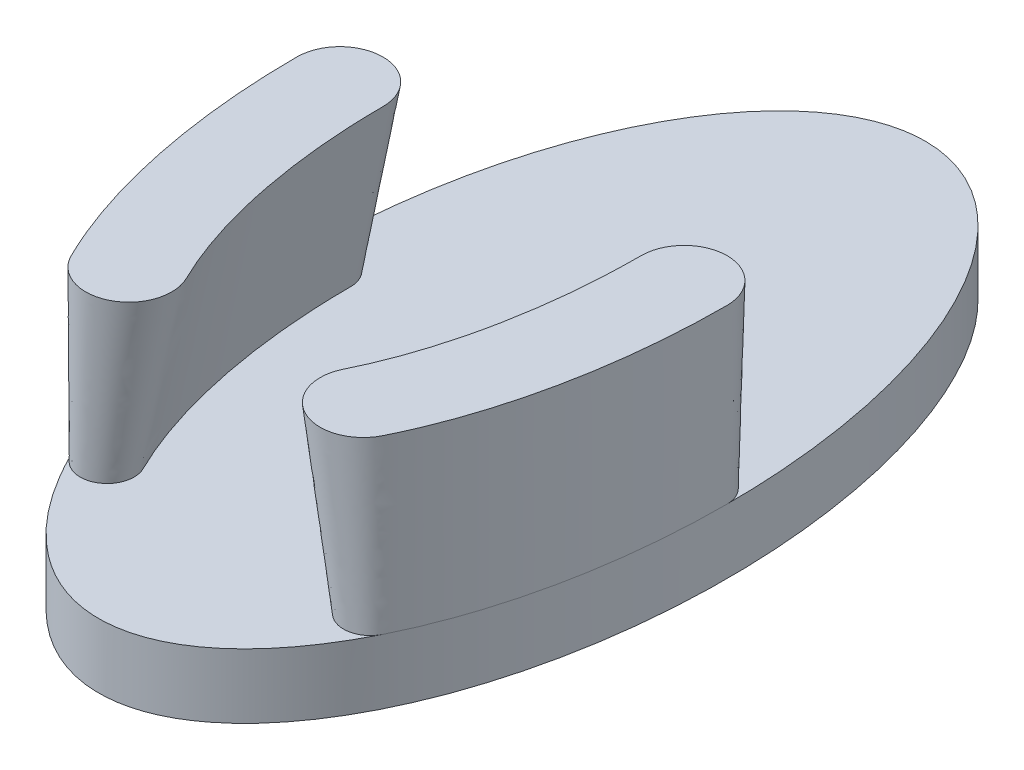
ISO-10303-21;
HEADER;
FILE_DESCRIPTION(('STEP AP214'),'2;1');
FILE_NAME('part.step','',(''),(''),'','','');
FILE_SCHEMA(('AUTOMOTIVE_DESIGN { 1 0 10303 214 1 1 1 1 }'));
ENDSEC;
DATA;
#1=APPLICATION_CONTEXT('core data for automotive mechanical design processes');
#2=APPLICATION_PROTOCOL_DEFINITION('international standard','automotive_design',2000,#1);
#3=PRODUCT_CONTEXT('',#1,'mechanical');
#4=PRODUCT('Part','Part','',(#3));
#5=PRODUCT_RELATED_PRODUCT_CATEGORY('part','',(#4));
#6=PRODUCT_DEFINITION_FORMATION('','',#4);
#7=PRODUCT_DEFINITION_CONTEXT('part definition',#1,'design');
#8=PRODUCT_DEFINITION('design','',#6,#7);
#9=PRODUCT_DEFINITION_SHAPE('','',#8);
#10=(LENGTH_UNIT() NAMED_UNIT(*) SI_UNIT(.MILLI.,.METRE.));
#11=(NAMED_UNIT(*) PLANE_ANGLE_UNIT() SI_UNIT($,.RADIAN.));
#12=(NAMED_UNIT(*) SI_UNIT($,.STERADIAN.) SOLID_ANGLE_UNIT());
#13=UNCERTAINTY_MEASURE_WITH_UNIT(LENGTH_MEASURE(1.E-05),#10,'distance_accuracy_value','');
#14=(GEOMETRIC_REPRESENTATION_CONTEXT(3) GLOBAL_UNCERTAINTY_ASSIGNED_CONTEXT((#13)) GLOBAL_UNIT_ASSIGNED_CONTEXT((#10,
#11,#12)) REPRESENTATION_CONTEXT('',''));
#15=CARTESIAN_POINT('',(0.,0.,0.));
#16=DIRECTION('',(0.,0.,1.));
#17=DIRECTION('',(1.,0.,0.));
#18=AXIS2_PLACEMENT_3D('',#15,#16,#17);
#19=CARTESIAN_POINT('',(0.,3.,0.));
#20=DIRECTION('',(0.,1.,0.));
#21=DIRECTION('',(0.,0.,1.));
#22=AXIS2_PLACEMENT_3D('',#19,#20,#21);
#23=PLANE('',#22);
#24=CARTESIAN_POINT('',(6.11987871457012,3.,12.6999444809469));
#25=DIRECTION('',(0.,-1.,0.));
#26=DIRECTION('',(0.,0.,1.));
#27=AXIS2_PLACEMENT_3D('',#24,#25,#26);
#28=CIRCLE('',#27,1.25);
#29=CARTESIAN_POINT('',(7.2397724042015,3.,13.2552641341771));
#30=VERTEX_POINT('',#29);
#31=CARTESIAN_POINT('',(5.00000000000003,3.,12.1446322582713));
#32=VERTEX_POINT('',#31);
#33=EDGE_CURVE('E247',#30,#32,#28,.T.);
#34=ORIENTED_EDGE('',*,*,#33,.T.);
#35=CARTESIAN_POINT('',(5.,3.,12.1446322582714));
#36=CARTESIAN_POINT('',(5.19774336303586,3.,11.7458501422494));
#37=CARTESIAN_POINT('',(5.55436612010594,3.,10.9531589873972));
#38=CARTESIAN_POINT('',(6.22056986626798,3.,9.15948566509267));
#39=CARTESIAN_POINT('',(6.88663015631573,3.,6.67624798111628));
#40=CARTESIAN_POINT('',(7.38711573347857,3.,3.41196846074801));
#41=CARTESIAN_POINT('',(7.5,3.,1.12988821116082));
#42=CARTESIAN_POINT('',(7.5,3.,0.));
#43=B_SPLINE_CURVE_WITH_KNOTS('',3,(#35,#36,#37,#38,#39,#40,#41,#42),.UNSPECIFIED.,.F.,.F.,(4,1,
1,1,1,4),(1.5707963267949,1.66595231404152,1.76110830128814,1.95142027578138,2.14173225027461,
2.33204422476785),.UNSPECIFIED.);
#44=CARTESIAN_POINT('',(7.5,3.,-1.37442928484785E-07));
#45=VERTEX_POINT('',#44);
#46=EDGE_CURVE('E252',#32,#45,#43,.T.);
#47=ORIENTED_EDGE('',*,*,#46,.T.);
#48=CARTESIAN_POINT('',(8.75,3.,0.));
#49=DIRECTION('',(0.,-1.,0.));
#50=DIRECTION('',(0.,0.,-1.));
#51=AXIS2_PLACEMENT_3D('',#48,#49,#50);
#52=CIRCLE('',#51,1.25);
#53=CARTESIAN_POINT('',(10.,3.,0.));
#54=VERTEX_POINT('',#53);
#55=EDGE_CURVE('E233',#45,#54,#52,.T.);
#56=ORIENTED_EDGE('',*,*,#55,.T.);
#57=CARTESIAN_POINT('',(0.,3.,0.));
#58=DIRECTION('',(0.,-1.,0.));
#59=DIRECTION('',(0.,0.,-1.));
#60=AXIS2_PLACEMENT_3D('',#57,#58,#59);
#61=ELLIPSE('',#60,19.2153784566105,10.);
#62=CARTESIAN_POINT('',(-9.99999999905929,3.,-0.000108424452932332));
#63=VERTEX_POINT('',#62);
#64=EDGE_CURVE('E502',#54,#63,#61,.F.);
#65=ORIENTED_EDGE('',*,*,#64,.T.);
#66=CARTESIAN_POINT('',(-7.5,3.,0.));
#67=CARTESIAN_POINT('',(-7.49998923633098,3.,-0.0351697874300073));
#68=CARTESIAN_POINT('',(-7.50143294013653,3.,-0.0703438189006792));
#69=CARTESIAN_POINT('',(-7.50726062229391,3.,-0.14044459233977));
#70=CARTESIAN_POINT('',(-7.51164442416949,3.,-0.175371349023445));
#71=CARTESIAN_POINT('',(-7.52337703823223,3.,-0.244687115002351));
#72=CARTESIAN_POINT('',(-7.53072251345142,3.,-0.279076684408285));
#73=CARTESIAN_POINT('',(-7.54833036462945,3.,-0.347091192160089));
#74=CARTESIAN_POINT('',(-7.55859279667201,3.,-0.380716115790849));
#75=CARTESIAN_POINT('',(-7.5936080859151,3.,-0.480122245831025));
#76=CARTESIAN_POINT('',(-7.62259420526411,3.,-0.544465473624005));
#77=CARTESIAN_POINT('',(-7.69085633688877,3.,-0.667396839264811));
#78=CARTESIAN_POINT('',(-7.73013230413657,3.,-0.725985002294966));
#79=CARTESIAN_POINT('',(-7.81810936134942,3.,-0.835915778969195));
#80=CARTESIAN_POINT('',(-7.86684066819131,3.,-0.887234225673415));
#81=CARTESIAN_POINT('',(-7.9722527972439,3.,-0.980984154243796));
#82=CARTESIAN_POINT('',(-8.02893368508665,3.,-1.02341556273102));
#83=CARTESIAN_POINT('',(-8.11861641034821,3.,-1.07936805200126));
#84=CARTESIAN_POINT('',(-8.14927926521871,3.,-1.09673304855542));
#85=CARTESIAN_POINT('',(-8.21192955359622,3.,-1.12879839917933));
#86=CARTESIAN_POINT('',(-8.24391565807669,3.,-1.14350135075364));
#87=CARTESIAN_POINT('',(-8.34158715591077,3.,-1.1834850306019));
#88=CARTESIAN_POINT('',(-8.40900983811339,3.,-1.20465557897171));
#89=CARTESIAN_POINT('',(-8.54634302819597,3.,-1.23537194437348));
#90=CARTESIAN_POINT('',(-8.616250769451,3.,-1.2449302963964));
#91=CARTESIAN_POINT('',(-8.75668577196107,3.,-1.2521057556406));
#92=CARTESIAN_POINT('',(-8.82721300795331,3.,-1.2497233475661));
#93=CARTESIAN_POINT('',(-8.96664004343919,3.,-1.23314936884242));
#94=CARTESIAN_POINT('',(-9.03554417589725,3.,-1.21899408909712));
#95=CARTESIAN_POINT('',(-9.17002117881914,3.,-1.17938937691705));
#96=CARTESIAN_POINT('',(-9.23559385954583,3.,-1.15393930200837));
#97=CARTESIAN_POINT('',(-9.36183439930573,3.,-1.09226017263906));
#98=CARTESIAN_POINT('',(-9.42248125554396,3.,-1.0559877588044));
#99=CARTESIAN_POINT('',(-9.50814787149243,3.,-0.994370836508828));
#100=CARTESIAN_POINT('',(-9.5358224408257,3.,-0.972627464425052));
#101=CARTESIAN_POINT('',(-9.58928000613686,3.,-0.926865544870687));
#102=CARTESIAN_POINT('',(-9.61506068936126,3.,-0.90284429507819));
#103=CARTESIAN_POINT('',(-9.68912323285703,3.,-0.827756552668588));
#104=CARTESIAN_POINT('',(-9.73428839033874,3.,-0.773548605441722));
#105=CARTESIAN_POINT('',(-9.81485447234115,3.,-0.658310749437763));
#106=CARTESIAN_POINT('',(-9.85025566168989,3.,-0.59728102575076));
#107=CARTESIAN_POINT('',(-9.89543790105036,3.,-0.501882838826152));
#108=CARTESIAN_POINT('',(-9.90920539897127,3.,-0.469346963329483));
#109=CARTESIAN_POINT('',(-9.93391979094434,3.,-0.403241911367588));
#110=CARTESIAN_POINT('',(-9.94486911433998,3.,-0.369673652982634));
#111=CARTESIAN_POINT('',(-9.96383569822752,3.,-0.301760026177581));
#112=CARTESIAN_POINT('',(-9.97185604743035,3.,-0.267415517178146));
#113=CARTESIAN_POINT('',(-9.98492352795874,3.,-0.198171568438072));
#114=CARTESIAN_POINT('',(-9.98997147281918,3.,-0.163272283225508));
#115=CARTESIAN_POINT('',(-9.99569977079587,3.,-0.106930653519564));
#116=CARTESIAN_POINT('',(-9.99731661506854,3.,-0.0855787612981533));
#117=CARTESIAN_POINT('',(-9.99946542714367,3.,-0.04285454886194));
#118=CARTESIAN_POINT('',(-9.99999912551782,3.,-0.0214823159030659));
#119=CARTESIAN_POINT('',(-9.99999999544732,3.,-0.00010842445262965));
#120=B_SPLINE_CURVE_WITH_KNOTS('',3,(#66,#67,#68,#69,#70,#71,#72,#73,#74,#75,#76,#77,#78,#79,
#80,#81,#82,#83,#84,#85,#86,#87,#88,#89,#90,#91,#92,#93,#94,#95,#96,#97,#98,#99,#100,#101,#102,
#103,#104,#105,#106,#107,#108,#109,#110,#111,#112,#113,#114,#115,#116,#117,#118,#119),
.UNSPECIFIED.,.F.,.F.,(4,2,2,2,2,2,2,2,2,2,2,2,2,2,2,2,2,2,2,2,2,2,2,2,2,2,4),(0.,
0.105484859426658,0.210963387803589,0.316323402352031,0.421685442772485,0.63231738863455,
0.842948412797248,1.05426398963555,1.26558131120602,1.37118693922898,1.47668896003441,
1.68760892611054,1.89830100800993,2.10898453747942,2.31902101333656,2.52906943808294,
2.73997098180776,2.8454468418955,2.95104943537915,3.16166003683901,3.37226492534746,
3.47814753072682,3.58393855437918,3.68961769314577,3.79526789450456,3.8594818815186,
3.92359319107138),.UNSPECIFIED.);
#121=CARTESIAN_POINT('',(-7.5,3.,0.));
#122=VERTEX_POINT('',#121);
#123=EDGE_CURVE('E459',#122,#63,#120,.T.);
#124=ORIENTED_EDGE('',*,*,#123,.F.);
#125=CARTESIAN_POINT('',(-5.00000000000003,3.,12.1446322582713));
#126=CARTESIAN_POINT('',(-5.06741385636489,3.,12.0086711300577));
#127=CARTESIAN_POINT('',(-5.1330116869429,3.,11.8718216882076));
#128=CARTESIAN_POINT('',(-5.26073653736773,3.,11.5965252535735));
#129=CARTESIAN_POINT('',(-5.32286384247364,3.,11.4580783932209));
#130=CARTESIAN_POINT('',(-5.50405381994333,3.,11.0411382573568));
#131=CARTESIAN_POINT('',(-5.61819530822051,3.,10.7604952338548));
#132=CARTESIAN_POINT('',(-5.83429328571383,3.,10.1948382992218));
#133=CARTESIAN_POINT('',(-5.93625913914259,3.,9.90982793984572));
#134=CARTESIAN_POINT('',(-6.1289109615006,3.,9.33606254139926));
#135=CARTESIAN_POINT('',(-6.21959810966435,3.,9.04730789730098));
#136=CARTESIAN_POINT('',(-6.38935730500458,3.,8.47057840211037));
#137=CARTESIAN_POINT('',(-6.46856751163175,3.,8.18264404813391));
#138=CARTESIAN_POINT('',(-6.61742635272034,3.,7.60420368596284));
#139=CARTESIAN_POINT('',(-6.68707133431754,3.,7.31369674015424));
#140=CARTESIAN_POINT('',(-6.8171715400268,3.,6.73056464954379));
#141=CARTESIAN_POINT('',(-6.87762460581459,3.,6.43793902410756));
#142=CARTESIAN_POINT('',(-6.98956621354144,3.,5.85099670788306));
#143=CARTESIAN_POINT('',(-7.04105518779658,3.,5.5566800993543));
#144=CARTESIAN_POINT('',(-7.13447381918345,3.,4.97322103510431));
#145=CARTESIAN_POINT('',(-7.17658989927882,3.,4.68410831164011));
#146=CARTESIAN_POINT('',(-7.25294957194358,3.,4.10492896673727));
#147=CARTESIAN_POINT('',(-7.28719535881017,3.,3.81486263410462));
#148=CARTESIAN_POINT('',(-7.34796639443396,3.,3.23395670164698));
#149=CARTESIAN_POINT('',(-7.37449251716567,3.,2.9431171931216));
#150=CARTESIAN_POINT('',(-7.42013746482407,3.,2.35795191804553));
#151=CARTESIAN_POINT('',(-7.43918010093686,3.,2.06362021656363));
#152=CARTESIAN_POINT('',(-7.4696177582379,3.,1.47453058366295));
#153=CARTESIAN_POINT('',(-7.48101194352042,3.,1.17977260918323));
#154=CARTESIAN_POINT('',(-7.49619809156091,3.,0.590009423492115));
#155=CARTESIAN_POINT('',(-7.49998873337344,3.,0.295004178227221));
#156=CARTESIAN_POINT('',(-7.5,3.,0.));
#157=B_SPLINE_CURVE_WITH_KNOTS('',3,(#125,#126,#127,#128,#129,#130,#131,#132,#133,#134,#135,
#136,#137,#138,#139,#140,#141,#142,#143,#144,#145,#146,#147,#148,#149,#150,#151,#152,#153,#154,
#155,#156),.UNSPECIFIED.,.F.,.F.,(4,2,2,2,2,2,2,2,2,2,2,2,2,2,2,4),(0.,0.455237869873625,
0.910438266343984,1.81900142557622,2.72686125078859,3.63462607562454,4.53034521380883,
5.42640547269032,6.32267580876717,7.21890290794881,8.09528525805587,8.97142296891083,
9.8474614500382,10.7322010625433,11.6170373532618,12.5020273511669),.UNSPECIFIED.);
#158=CARTESIAN_POINT('',(-5.00000000000003,3.,12.1446322582713));
#159=VERTEX_POINT('',#158);
#160=EDGE_CURVE('E314',#159,#122,#157,.T.);
#161=ORIENTED_EDGE('',*,*,#160,.F.);
#162=CARTESIAN_POINT('',(-5.00000000000003,3.,12.1446322582713));
#163=CARTESIAN_POINT('',(-4.98436756747829,3.,12.1761334189842));
#164=CARTESIAN_POINT('',(-4.97003607818218,3.,12.2082844120324));
#165=CARTESIAN_POINT('',(-4.94411666041171,3.,12.2736708974496));
#166=CARTESIAN_POINT('',(-4.93252856760844,3.,12.3069063247253));
#167=CARTESIAN_POINT('',(-4.91224711077415,3.,12.3742125051203));
#168=CARTESIAN_POINT('',(-4.90355050884363,3.,12.4082822777047));
#169=CARTESIAN_POINT('',(-4.88910971713279,3.,12.4770325799225));
#170=CARTESIAN_POINT('',(-4.88336558403117,3.,12.5117131212677));
#171=CARTESIAN_POINT('',(-4.87057273489121,3.,12.6163173074228));
#172=CARTESIAN_POINT('',(-4.86795467025053,3.,12.6868333157312));
#173=CARTESIAN_POINT('',(-4.87449187904725,3.,12.8272812613031));
#174=CARTESIAN_POINT('',(-4.88364710533248,3.,12.8972132009047));
#175=CARTESIAN_POINT('',(-4.9136198119986,3.,13.0347799919223));
#176=CARTESIAN_POINT('',(-4.93447610810218,3.,13.1024063990494));
#177=CARTESIAN_POINT('',(-4.98725895392603,3.,13.2332296007828));
#178=CARTESIAN_POINT('',(-5.01918559682356,3.,13.2964263581003));
#179=CARTESIAN_POINT('',(-5.07467034862052,3.,13.3863991850085));
#180=CARTESIAN_POINT('',(-5.09442516418968,3.,13.4155797019752));
#181=CARTESIAN_POINT('',(-5.13630536884159,3.,13.4721420541265));
#182=CARTESIAN_POINT('',(-5.15842841310503,3.,13.4995256259348));
#183=CARTESIAN_POINT('',(-5.22816518753727,3.,13.5787418627091));
#184=CARTESIAN_POINT('',(-5.2791614892588,3.,13.6276641884982));
#185=CARTESIAN_POINT('',(-5.38854770808781,3.,13.7161997948698));
#186=CARTESIAN_POINT('',(-5.44692956727691,3.,13.7558230885091));
#187=CARTESIAN_POINT('',(-5.56955378920508,3.,13.82464709292));
#188=CARTESIAN_POINT('',(-5.63379591219519,3.,13.853848229832));
#189=CARTESIAN_POINT('',(-5.76606914636574,3.,13.9009478907803));
#190=CARTESIAN_POINT('',(-5.83408802158937,3.,13.9188808340669));
#191=CARTESIAN_POINT('',(-5.97215940117361,3.,13.9431484590392));
#192=CARTESIAN_POINT('',(-6.04221202115559,3.,13.9494824799922));
#193=CARTESIAN_POINT('',(-6.18271240029679,3.,13.9503146606871));
#194=CARTESIAN_POINT('',(-6.25316060844346,3.,13.9447646242677));
#195=CARTESIAN_POINT('',(-6.3572839716545,3.,13.9276253668684));
#196=CARTESIAN_POINT('',(-6.39173752045812,3.,13.9204418982254));
#197=CARTESIAN_POINT('',(-6.45996087512529,3.,13.9031962552631));
#198=CARTESIAN_POINT('',(-6.49372980956833,3.,13.8931306319288));
#199=CARTESIAN_POINT('',(-6.59344231858928,3.,13.8587675207517));
#200=CARTESIAN_POINT('',(-6.65798947163239,3.,13.830270922375));
#201=CARTESIAN_POINT('',(-6.78136718409368,3.,13.7628278263663));
#202=CARTESIAN_POINT('',(-6.84019790403726,3.,13.7238816222892));
#203=CARTESIAN_POINT('',(-6.92306195096715,3.,13.6584907244831));
#204=CARTESIAN_POINT('',(-6.94985236901167,3.,13.6354589249055));
#205=CARTESIAN_POINT('',(-7.00136540872635,3.,13.5872162334711));
#206=CARTESIAN_POINT('',(-7.02608979176863,3.,13.5620072358302));
#207=CARTESIAN_POINT('',(-7.07325564653315,3.,13.5095916750843));
#208=CARTESIAN_POINT('',(-7.0956996235654,3.,13.482387361942));
#209=CARTESIAN_POINT('',(-7.1381704546777,3.,13.4261607731123));
#210=CARTESIAN_POINT('',(-7.15819799831501,3.,13.3971390196605));
#211=CARTESIAN_POINT('',(-7.18782887205321,3.,13.3500572437491));
#212=CARTESIAN_POINT('',(-7.19827376377268,3.,13.3325205884002));
#213=CARTESIAN_POINT('',(-7.21828862736856,3.,13.2969907923087));
#214=CARTESIAN_POINT('',(-7.22785993771561,3.,13.2789984057622));
#215=CARTESIAN_POINT('',(-7.2369986188279,3.,13.2607869757255));
#216=B_SPLINE_CURVE_WITH_KNOTS('',3,(#162,#163,#164,#165,#166,#167,#168,#169,#170,#171,#172,
#173,#174,#175,#176,#177,#178,#179,#180,#181,#182,#183,#184,#185,#186,#187,#188,#189,#190,#191,
#192,#193,#194,#195,#196,#197,#198,#199,#200,#201,#202,#203,#204,#205,#206,#207,#208,#209,#210,
#211,#212,#213,#214,#215),.UNSPECIFIED.,.F.,.F.,(4,2,2,2,2,2,2,2,2,2,2,2,2,2,2,2,2,2,2,2,2,2,2,
2,2,2,4),(0.,0.105475568514806,0.210944817464562,0.316295560726865,0.421648326337347,
0.632261752152478,0.842874334460941,1.05418974419906,1.26550693258688,1.37111262503431,
1.47661470622512,1.68753480651131,1.89822673835923,2.1089100544618,2.31894665902866,
2.52899522795817,2.73989726831525,2.84537284000529,2.95097516345677,3.16158572761443,
3.37219037582358,3.47807566307298,3.58386973806077,3.68954629893922,3.7951926321053,
3.85640571629889,3.91752337970594),.UNSPECIFIED.);
#217=CARTESIAN_POINT('',(-7.23700744780766,3.,13.2607914065783));
#218=VERTEX_POINT('',#217);
#219=EDGE_CURVE('E12',#159,#218,#216,.T.);
#220=ORIENTED_EDGE('',*,*,#219,.T.);
#221=CARTESIAN_POINT('',(0.,3.,0.));
#222=DIRECTION('',(0.,-1.,0.));
#223=DIRECTION('',(0.,0.,-1.));
#224=AXIS2_PLACEMENT_3D('',#221,#222,#223);
#225=ELLIPSE('',#224,19.2153784566105,10.);
#226=EDGE_CURVE('E491',#218,#30,#225,.F.);
#227=ORIENTED_EDGE('',*,*,#226,.T.);
#228=EDGE_LOOP('',(#34,#47,#56,#65,#124,#161,#220,#227));
#229=FACE_BOUND('',#228,.T.);
#230=ADVANCED_FACE('F227',(#229),#23,.T.);
#231=CARTESIAN_POINT('',(0.,3.,0.));
#232=DIRECTION('',(0.,1.,0.));
#233=DIRECTION('',(0.,0.,-1.));
#234=AXIS2_PLACEMENT_3D('',#231,#232,#233);
#235=ELLIPSE('',#234,19.2153784566105,10.);
#236=DIRECTION('',(0.,-1.,0.));
#237=VECTOR('',#236,1.);
#238=SURFACE_OF_LINEAR_EXTRUSION('',#235,#237);
#239=CARTESIAN_POINT('',(-7.49999999999704,3.00000000001577,-1.37442928566101E-07));
#240=CARTESIAN_POINT('',(-7.49999999999704,3.00000000001577,-0.200380976050194));
#241=CARTESIAN_POINT('',(-7.59305965676937,3.00000000001577,-0.560182563012823));
#242=CARTESIAN_POINT('',(-7.89957132898389,3.00000000001577,-0.956796626625263));
#243=CARTESIAN_POINT('',(-8.30355208396816,3.00000000001577,-1.19729478627668));
#244=CARTESIAN_POINT('',(-8.75563644430376,3.00000000001577,-1.2775348162858));
#245=CARTESIAN_POINT('',(-9.2064589325721,3.00000000001577,-1.19337449097147));
#246=CARTESIAN_POINT('',(-9.60728247841398,3.00000000001577,-0.950348440176666));
#247=CARTESIAN_POINT('',(-9.90937001147042,3.00000000001576,-0.553991293744492));
#248=CARTESIAN_POINT('',(-10.,3.00000000001577,-0.197477032565118));
#249=CARTESIAN_POINT('',(-10.,3.00000000001577,1.07007758719881));
#250=CARTESIAN_POINT('',(-9.90684263440334,3.00000000001577,3.30254925546166));
#251=CARTESIAN_POINT('',(-9.41997503267536,3.00000000001577,6.79798757967938));
#252=CARTESIAN_POINT('',(-8.54810267231943,3.00000000001577,10.2191596611933));
#253=CARTESIAN_POINT('',(-7.7151391598463,3.00000000001577,12.2965710133483));
#254=CARTESIAN_POINT('',(-7.15202830123536,3.00000000001577,13.4321769639312));
#255=CARTESIAN_POINT('',(-6.91245124375771,3.00000000001576,13.7113167976625));
#256=CARTESIAN_POINT('',(-6.46572855082538,3.00000000001577,13.9322120234489));
#257=CARTESIAN_POINT('',(-5.99866527584796,3.00000000001577,13.9718740132321));
#258=CARTESIAN_POINT('',(-5.55738386306983,3.00000000001577,13.8469957083829));
#259=CARTESIAN_POINT('',(-5.18800675673547,3.00000000001577,13.5742700502721));
#260=CARTESIAN_POINT('',(-4.93292045192152,3.00000000001577,13.1793386735878));
#261=CARTESIAN_POINT('',(-4.8345114437044,3.00000000001577,12.6878432130181));
#262=CARTESIAN_POINT('',(-4.9109807958435,3.00000000001577,12.3241541701768));
#263=CARTESIAN_POINT('',(-5.21509827906861,3.00000000001577,11.710851090782));
#264=CARTESIAN_POINT('',(-5.61900196781587,3.00000000001577,10.8032419363601));
#265=CARTESIAN_POINT('',(-6.31772248773509,3.00000000001577,8.85581412877824));
#266=CARTESIAN_POINT('',(-6.97924394219122,3.00000000001577,6.22609489487608));
#267=CARTESIAN_POINT('',(-7.41805609330835,3.00000000001576,3.00323312548161));
#268=CARTESIAN_POINT('',(-7.49999999999704,3.00000000001577,0.968366399513625));
#269=CARTESIAN_POINT('',(-7.49999999999704,3.00000000001577,-1.37442928484785E-07));
#270=B_SPLINE_CURVE_WITH_KNOTS('',3,(#239,#240,#241,#242,#243,#244,#245,#246,#247,#248,#249,
#250,#251,#252,#253,#254,#255,#256,#257,#258,#259,#260,#261,#262,#263,#264,#265,#266,#267,#268,
#269),.UNSPECIFIED.,.T.,.F.,(4,1,1,1,1,1,1,1,2,1,1,1,2,1,1,1,1,1,1,1,2,1,1,1,1,4),(0.,
0.0175421666587561,0.0350843333175123,0.0526264999762683,0.0701686666350245,0.0877108332937806,
0.105252999952537,0.122795166611293,0.140337333270049,0.235393858344356,0.330450383418663,
0.425506908492969,0.520563433567276,0.538105600226032,0.555647766884788,0.573189933543544,
0.5907321002023,0.608274266861057,0.625816433519813,0.643358600178569,0.660900766837325,
0.703288170982659,0.745675575127994,0.830450383418663,0.915225191709331,1.),.UNSPECIFIED.);
#271=CARTESIAN_POINT('',(-7.23976640774592,3.,13.2552611595919));
#272=VERTEX_POINT('',#271);
#273=EDGE_CURVE('E239',#63,#272,#270,.T.);
#274=ORIENTED_EDGE('',*,*,#273,.F.);
#275=ORIENTED_EDGE('',*,*,#64,.F.);
#276=CARTESIAN_POINT('',(7.49999999999704,3.00000000001577,-1.37442928484785E-07));
#277=CARTESIAN_POINT('',(7.49999999999704,3.00000000001577,0.968366399513625));
#278=CARTESIAN_POINT('',(7.41805609330835,3.00000000001576,3.00323312548161));
#279=CARTESIAN_POINT('',(6.97924394219122,3.00000000001577,6.22609489487608));
#280=CARTESIAN_POINT('',(6.31772248773509,3.00000000001577,8.85581412877824));
#281=CARTESIAN_POINT('',(5.61900196781587,3.00000000001577,10.8032419363601));
#282=CARTESIAN_POINT('',(5.21509827906861,3.00000000001577,11.710851090782));
#283=CARTESIAN_POINT('',(4.9109807958435,3.00000000001577,12.3241541701768));
#284=CARTESIAN_POINT('',(4.8345114437044,3.00000000001577,12.6878432130181));
#285=CARTESIAN_POINT('',(4.93292045192152,3.00000000001577,13.1793386735878));
#286=CARTESIAN_POINT('',(5.18800675673547,3.00000000001577,13.5742700502721));
#287=CARTESIAN_POINT('',(5.55738386306983,3.00000000001577,13.8469957083829));
#288=CARTESIAN_POINT('',(5.99866527584796,3.00000000001577,13.9718740132321));
#289=CARTESIAN_POINT('',(6.46572855082538,3.00000000001577,13.9322120234489));
#290=CARTESIAN_POINT('',(6.91245124375771,3.00000000001576,13.7113167976625));
#291=CARTESIAN_POINT('',(7.15202830123536,3.00000000001577,13.4321769639312));
#292=CARTESIAN_POINT('',(7.7151391598463,3.00000000001577,12.2965710133483));
#293=CARTESIAN_POINT('',(8.54810267231943,3.00000000001577,10.2191596611933));
#294=CARTESIAN_POINT('',(9.41997503267536,3.00000000001577,6.79798757967938));
#295=CARTESIAN_POINT('',(9.90684263440334,3.00000000001577,3.30254925546166));
#296=CARTESIAN_POINT('',(10.,3.00000000001577,1.07007758719881));
#297=CARTESIAN_POINT('',(10.,3.00000000001577,-0.197477032565118));
#298=CARTESIAN_POINT('',(9.90937001147042,3.00000000001576,-0.553991293744492));
#299=CARTESIAN_POINT('',(9.60728247841398,3.00000000001577,-0.950348440176666));
#300=CARTESIAN_POINT('',(9.2064589325721,3.00000000001577,-1.19337449097147));
#301=CARTESIAN_POINT('',(8.75563644430376,3.00000000001577,-1.2775348162858));
#302=CARTESIAN_POINT('',(8.30355208396816,3.00000000001577,-1.19729478627668));
#303=CARTESIAN_POINT('',(7.89957132898389,3.00000000001577,-0.956796626625263));
#304=CARTESIAN_POINT('',(7.59305965676937,3.00000000001577,-0.560182563012823));
#305=CARTESIAN_POINT('',(7.49999999999704,3.00000000001577,-0.200380976050194));
#306=CARTESIAN_POINT('',(7.49999999999704,3.00000000001577,-1.37442928566101E-07));
#307=B_SPLINE_CURVE_WITH_KNOTS('',3,(#276,#277,#278,#279,#280,#281,#282,#283,#284,#285,#286,
#287,#288,#289,#290,#291,#292,#293,#294,#295,#296,#297,#298,#299,#300,#301,#302,#303,#304,#305,
#306),.UNSPECIFIED.,.T.,.F.,(4,1,1,1,1,2,1,1,1,1,1,1,1,2,1,1,1,2,1,1,1,1,1,1,1,4),(0.,
0.0847748082906687,0.169549616581337,0.254324424872006,0.296711829017341,0.339099233162675,
0.356641399821431,0.374183566480187,0.391725733138943,0.4092678997977,0.426810066456456,
0.444352233115212,0.461894399773968,0.479436566432724,0.574493091507031,0.669549616581337,
0.764606141655644,0.859662666729951,0.877204833388707,0.894747000047463,0.912289166706219,
0.929831333364975,0.947373500023732,0.964915666682488,0.982457833341244,1.),.UNSPECIFIED.);
#308=EDGE_CURVE('E389',#30,#54,#307,.T.);
#309=ORIENTED_EDGE('',*,*,#308,.F.);
#310=ORIENTED_EDGE('',*,*,#226,.F.);
#311=CARTESIAN_POINT('',(-6.11987871457012,3.,12.6999444809469));
#312=DIRECTION('',(0.,1.,0.));
#313=DIRECTION('',(0.,0.,1.));
#314=AXIS2_PLACEMENT_3D('',#311,#312,#313);
#315=CIRCLE('',#314,1.25);
#316=EDGE_CURVE('E462',#272,#218,#315,.T.);
#317=ORIENTED_EDGE('',*,*,#316,.F.);
#318=EDGE_LOOP('',(#274,#275,#309,#310,#317));
#319=FACE_BOUND('',#318,.T.);
#320=CARTESIAN_POINT('',(0.,0.,0.));
#321=DIRECTION('',(0.,1.,0.));
#322=DIRECTION('',(0.,0.,-1.));
#323=AXIS2_PLACEMENT_3D('',#320,#321,#322);
#324=ELLIPSE('',#323,19.2153784566105,10.);
#325=CARTESIAN_POINT('',(0.,0.,-19.2153784566105));
#326=VERTEX_POINT('',#325);
#327=EDGE_CURVE('E500',#326,#326,#324,.T.);
#328=ORIENTED_EDGE('',*,*,#327,.T.);
#329=EDGE_LOOP('',(#328));
#330=FACE_BOUND('',#329,.T.);
#331=ADVANCED_FACE('F229',(#319,#330),#238,.F.);
#332=CARTESIAN_POINT('',(0.,0.,0.));
#333=DIRECTION('',(0.,1.,0.));
#334=DIRECTION('',(0.,0.,1.));
#335=AXIS2_PLACEMENT_3D('',#332,#333,#334);
#336=PLANE('',#335);
#337=ORIENTED_EDGE('',*,*,#327,.F.);
#338=EDGE_LOOP('',(#337));
#339=FACE_BOUND('',#338,.T.);
#340=ADVANCED_FACE('F643',(#339),#336,.F.);
#341=CARTESIAN_POINT('',(0.,11.,0.));
#342=DIRECTION('',(0.,1.,0.));
#343=DIRECTION('',(0.,0.,1.));
#344=AXIS2_PLACEMENT_3D('',#341,#342,#343);
#345=PLANE('',#344);
#346=CARTESIAN_POINT('',(0.,11.,0.));
#347=DIRECTION('',(0.,1.,0.));
#348=DIRECTION('',(0.,0.,-1.));
#349=AXIS2_PLACEMENT_3D('',#346,#347,#348);
#350=ELLIPSE('',#349,19.2153784566105,10.);
#351=CARTESIAN_POINT('',(-10.,11.,0.));
#352=VERTEX_POINT('',#351);
#353=CARTESIAN_POINT('',(-7.23975742909287,11.,13.2552567037178));
#354=VERTEX_POINT('',#353);
#355=EDGE_CURVE('E461',#352,#354,#350,.T.);
#356=ORIENTED_EDGE('',*,*,#355,.T.);
#357=CARTESIAN_POINT('',(-5.44795148582805,11.,12.3667571473416));
#358=DIRECTION('',(0.,1.,0.));
#359=DIRECTION('',(0.,0.,1.));
#360=AXIS2_PLACEMENT_3D('',#357,#358,#359);
#361=CIRCLE('',#360,2.);
#362=CARTESIAN_POINT('',(-3.65614554253424,11.,11.4782575910237));
#363=VERTEX_POINT('',#362);
#364=EDGE_CURVE('E518',#354,#363,#361,.T.);
#365=ORIENTED_EDGE('',*,*,#364,.T.);
#366=CARTESIAN_POINT('',(-3.65614554251586,11.,11.4782575910608));
#367=CARTESIAN_POINT('',(-3.83787846812092,11.,11.1117631635816));
#368=CARTESIAN_POINT('',(-4.16393545626671,11.,10.3871155464064));
#369=CARTESIAN_POINT('',(-4.78554324293752,11.,8.71512917895576));
#370=CARTESIAN_POINT('',(-5.41457711957799,11.,6.37278874041161));
#371=CARTESIAN_POINT('',(-5.89195702394846,11.,3.26356167116729));
#372=CARTESIAN_POINT('',(-6.,11.,1.07994853978221));
#373=CARTESIAN_POINT('',(-6.,11.,0.));
#374=B_SPLINE_CURVE_WITH_KNOTS('',3,(#366,#367,#368,#369,#370,#371,#372,#373),.UNSPECIFIED.,.F.,
.F.,(4,1,1,1,1,4),(1.5707963267949,1.66595231404152,1.76110830128814,1.95142027578138,
2.14173225027461,2.33204422476785),.UNSPECIFIED.);
#375=CARTESIAN_POINT('',(-6.,11.,0.));
#376=VERTEX_POINT('',#375);
#377=EDGE_CURVE('E513',#363,#376,#374,.T.);
#378=ORIENTED_EDGE('',*,*,#377,.T.);
#379=CARTESIAN_POINT('',(-8.,11.,0.));
#380=DIRECTION('',(0.,1.,0.));
#381=DIRECTION('',(0.,0.,-1.));
#382=AXIS2_PLACEMENT_3D('',#379,#380,#381);
#383=CIRCLE('',#382,2.);
#384=EDGE_CURVE('E395',#376,#352,#383,.T.);
#385=ORIENTED_EDGE('',*,*,#384,.T.);
#386=EDGE_LOOP('',(#356,#365,#378,#385));
#387=FACE_BOUND('',#386,.T.);
#388=ADVANCED_FACE('F412',(#387),#345,.T.);
#389=CARTESIAN_POINT('',(-6.,11.,-1.81184581687964E-07));
#390=CARTESIAN_POINT('',(-7.5,3.,-1.37442928484785E-07));
#391=CARTESIAN_POINT('',(-6.,11.,1.06654288183967));
#392=CARTESIAN_POINT('',(-7.5,3.,0.968366399513431));
#393=CARTESIAN_POINT('',(-5.89986382147543,11.,3.06173702743344));
#394=CARTESIAN_POINT('',(-7.41805609331134,3.,3.00323312548149));
#395=CARTESIAN_POINT('',(-5.5038312833584,11.,5.88135721216804));
#396=CARTESIAN_POINT('',(-6.97924394219413,3.,6.22609489487676));
#397=CARTESIAN_POINT('',(-4.94559112643827,11.,8.18669988308947));
#398=CARTESIAN_POINT('',(-6.31772248773779,3.,8.85581412877956));
#399=CARTESIAN_POINT('',(-4.30294103195165,11.,10.0534123435734));
#400=CARTESIAN_POINT('',(-5.61900196781846,3.,10.8032419363616));
#401=CARTESIAN_POINT('',(-3.8930512618331,11.,11.0004981224414));
#402=CARTESIAN_POINT('',(-5.21509827907122,3.,11.7108510907834));
#403=CARTESIAN_POINT('',(-3.55810123401716,11.,11.6759801148753));
#404=CARTESIAN_POINT('',(-4.91098079584616,3.,12.3241541701781));
#405=CARTESIAN_POINT('',(-3.41786959341168,11.,12.1241893113608));
#406=CARTESIAN_POINT('',(-4.83451144370719,3.,12.6878432130192));
#407=CARTESIAN_POINT('',(-3.46455020866585,11.,12.897724484328));
#408=CARTESIAN_POINT('',(-4.93292045192441,3.,13.1793386735884));
#409=CARTESIAN_POINT('',(-3.83583481703412,11.,13.6502824196182));
#410=CARTESIAN_POINT('',(-5.18800675673813,3.,13.574270050272));
#411=CARTESIAN_POINT('',(-4.51679050012787,11.,14.2088990278472));
#412=CARTESIAN_POINT('',(-5.55738386307188,3.,13.8469957083822));
#413=CARTESIAN_POINT('',(-5.37347193075919,11.,14.4269344420385));
#414=CARTESIAN_POINT('',(-5.99866527584919,3.,13.9718740132312));
#415=CARTESIAN_POINT('',(-6.20730777672504,11.,14.275809472043));
#416=CARTESIAN_POINT('',(-6.46572855082589,3.,13.9322120234482));
#417=CARTESIAN_POINT('',(-6.86334823178564,11.,13.8439070054812));
#418=CARTESIAN_POINT('',(-6.91245124375781,2.99999999999999,13.7113167976622));
#419=CARTESIAN_POINT('',(-7.14027048490136,11.,13.4558885404185));
#420=CARTESIAN_POINT('',(-7.15202830123538,3.,13.4321769639312));
#421=CARTESIAN_POINT('',(-7.77885176262335,11.,12.1680840382983));
#422=CARTESIAN_POINT('',(-7.71513915984618,3.,12.2965710133486));
#423=CARTESIAN_POINT('',(-8.60684080678516,11.,10.0118194425387));
#424=CARTESIAN_POINT('',(-8.54810267231931,3.,10.2191596611937));
#425=CARTESIAN_POINT('',(-9.41124486531355,11.,6.79655926761284));
#426=CARTESIAN_POINT('',(-9.41997503267537,3.,6.79798757967939));
#427=CARTESIAN_POINT('',(-9.88311170325713,11.,3.5158961229094));
#428=CARTESIAN_POINT('',(-9.90684263440338,3.,3.30254925546124));
#429=CARTESIAN_POINT('',(-10.,11.,1.21349375961367));
#430=CARTESIAN_POINT('',(-10.,3.,1.07007758719852));
#431=CARTESIAN_POINT('',(-10.,11.,-0.223943711700483));
#432=CARTESIAN_POINT('',(-10.,3.,-0.197477032565065));
#433=CARTESIAN_POINT('',(-9.9242816475344,11.,-0.694593257116434));
#434=CARTESIAN_POINT('',(-9.9093700114704,3.,-0.553991293744215));
#435=CARTESIAN_POINT('',(-9.5284056292674,11.,-1.37298178698653));
#436=CARTESIAN_POINT('',(-9.60728247841414,3.,-0.950348440175833));
#437=CARTESIAN_POINT('',(-8.84850685138511,11.,-1.87880648627271));
#438=CARTESIAN_POINT('',(-9.2064589325728,3.,-1.19337449097012));
#439=CARTESIAN_POINT('',(-7.98414122753875,11.,-2.06404844626747));
#440=CARTESIAN_POINT('',(-8.75563644430528,3.,-1.27753481628425));
#441=CARTESIAN_POINT('',(-7.12590570321768,11.,-1.86609657807648));
#442=CARTESIAN_POINT('',(-8.30355208397048,3.,-1.19729478627536));
#443=CARTESIAN_POINT('',(-6.45894702345988,11.,-1.35682079240109));
#444=CARTESIAN_POINT('',(-7.89957132898673,3.,-0.956796626624475));
#445=CARTESIAN_POINT('',(-6.07348289256053,11.,-0.684546185229463));
#446=CARTESIAN_POINT('',(-7.59305965677236,3.,-0.560182563012578));
#447=CARTESIAN_POINT('',(-6.,11.,-0.220696358947228));
#448=CARTESIAN_POINT('',(-7.5,3.,-0.200380976050154));
#449=CARTESIAN_POINT('',(-6.,11.,-1.81184581687964E-07));
#450=CARTESIAN_POINT('',(-7.5,3.,-1.37442928484785E-07));
#451=B_SPLINE_SURFACE_WITH_KNOTS('',3,1,((#389,#390),(#391,#392),(#393,#394),(#395,#396),(#397,
#398),(#399,#400),(#401,#402),(#403,#404),(#405,#406),(#407,#408),(#409,#410),(#411,#412),(#413,
#414),(#415,#416),(#417,#418),(#419,#420),(#421,#422),(#423,#424),(#425,#426),(#427,#428),(#429,
#430),(#431,#432),(#433,#434),(#435,#436),(#437,#438),(#439,#440),(#441,#442),(#443,#444),(#445,
#446),(#447,#448),(#449,#450)),.UNSPECIFIED.,.T.,.F.,.F.,(4,1,1,1,1,2,1,1,1,1,1,1,1,2,1,1,1,2,1,
1,1,1,1,1,1,4),(2,2),(0.,0.0847748082906687,0.169549616581337,0.254324424872006,
0.296711829017341,0.339099233162675,0.356641399821431,0.374183566480187,0.391725733138943,
0.4092678997977,0.426810066456456,0.444352233115212,0.461894399773968,0.479436566432724,
0.574493091507031,0.669549616581337,0.764606141655644,0.859662666729951,0.877204833388707,
0.894747000047463,0.912289166706219,0.929831333364975,0.947373500023732,0.964915666682488,
0.982457833341244,1.),(0.,1.),.UNSPECIFIED.);
#452=ORIENTED_EDGE('',*,*,#377,.F.);
#453=ORIENTED_EDGE('',*,*,#364,.F.);
#454=ORIENTED_EDGE('',*,*,#355,.F.);
#455=ORIENTED_EDGE('',*,*,#384,.F.);
#456=EDGE_LOOP('',(#452,#453,#454,#455));
#457=FACE_BOUND('',#456,.T.);
#458=ORIENTED_EDGE('',*,*,#123,.T.);
#459=ORIENTED_EDGE('',*,*,#273,.T.);
#460=ORIENTED_EDGE('',*,*,#316,.T.);
#461=ORIENTED_EDGE('',*,*,#219,.F.);
#462=ORIENTED_EDGE('',*,*,#160,.T.);
#463=EDGE_LOOP('',(#458,#459,#460,#461,#462));
#464=FACE_BOUND('',#463,.T.);
#465=ADVANCED_FACE('F339',(#457,#464),#451,.T.);
#466=CARTESIAN_POINT('',(0.,11.,0.));
#467=DIRECTION('',(0.,1.,0.));
#468=DIRECTION('',(0.,0.,1.));
#469=AXIS2_PLACEMENT_3D('',#466,#467,#468);
#470=PLANE('',#469);
#471=CARTESIAN_POINT('',(0.,11.,0.));
#472=DIRECTION('',(0.,-1.,0.));
#473=DIRECTION('',(0.,0.,-1.));
#474=AXIS2_PLACEMENT_3D('',#471,#472,#473);
#475=ELLIPSE('',#474,19.2153784566105,10.);
#476=CARTESIAN_POINT('',(10.,11.,0.));
#477=VERTEX_POINT('',#476);
#478=CARTESIAN_POINT('',(7.23975742909287,11.,13.2552567037178));
#479=VERTEX_POINT('',#478);
#480=EDGE_CURVE('E307',#477,#479,#475,.T.);
#481=ORIENTED_EDGE('',*,*,#480,.F.);
#482=CARTESIAN_POINT('',(8.,11.,0.));
#483=DIRECTION('',(0.,-1.,0.));
#484=DIRECTION('',(0.,0.,-1.));
#485=AXIS2_PLACEMENT_3D('',#482,#483,#484);
#486=CIRCLE('',#485,2.);
#487=CARTESIAN_POINT('',(6.,11.,0.));
#488=VERTEX_POINT('',#487);
#489=EDGE_CURVE('E302',#488,#477,#486,.T.);
#490=ORIENTED_EDGE('',*,*,#489,.F.);
#491=CARTESIAN_POINT('',(3.65614554251586,11.,11.4782575910608));
#492=CARTESIAN_POINT('',(3.83787846812092,11.,11.1117631635816));
#493=CARTESIAN_POINT('',(4.16393545626671,11.,10.3871155464064));
#494=CARTESIAN_POINT('',(4.78554324293752,11.,8.71512917895576));
#495=CARTESIAN_POINT('',(5.41457711957799,11.,6.37278874041161));
#496=CARTESIAN_POINT('',(5.89195702394846,11.,3.26356167116729));
#497=CARTESIAN_POINT('',(6.,11.,1.07994853978221));
#498=CARTESIAN_POINT('',(6.,11.,0.));
#499=B_SPLINE_CURVE_WITH_KNOTS('',3,(#491,#492,#493,#494,#495,#496,#497,#498),.UNSPECIFIED.,.F.,
.F.,(4,1,1,1,1,4),(1.5707963267949,1.66595231404152,1.76110830128814,1.95142027578138,
2.14173225027461,2.33204422476785),.UNSPECIFIED.);
#500=CARTESIAN_POINT('',(3.65614554253424,11.,11.4782575910237));
#501=VERTEX_POINT('',#500);
#502=EDGE_CURVE('E310',#501,#488,#499,.T.);
#503=ORIENTED_EDGE('',*,*,#502,.F.);
#504=CARTESIAN_POINT('',(5.44795148582805,11.,12.3667571473416));
#505=DIRECTION('',(0.,-1.,0.));
#506=DIRECTION('',(0.,0.,1.));
#507=AXIS2_PLACEMENT_3D('',#504,#505,#506);
#508=CIRCLE('',#507,2.);
#509=EDGE_CURVE('E319',#479,#501,#508,.T.);
#510=ORIENTED_EDGE('',*,*,#509,.F.);
#511=EDGE_LOOP('',(#481,#490,#503,#510));
#512=FACE_BOUND('',#511,.T.);
#513=ADVANCED_FACE('F318',(#512),#470,.T.);
#514=CARTESIAN_POINT('',(6.,11.,-1.81184581687964E-07));
#515=CARTESIAN_POINT('',(7.5,3.,-1.37442928484785E-07));
#516=CARTESIAN_POINT('',(6.,11.,1.06654288183967));
#517=CARTESIAN_POINT('',(7.5,3.,0.968366399513431));
#518=CARTESIAN_POINT('',(5.89986382147543,11.,3.06173702743344));
#519=CARTESIAN_POINT('',(7.41805609331134,3.,3.00323312548149));
#520=CARTESIAN_POINT('',(5.5038312833584,11.,5.88135721216804));
#521=CARTESIAN_POINT('',(6.97924394219413,3.,6.22609489487676));
#522=CARTESIAN_POINT('',(4.94559112643827,11.,8.18669988308947));
#523=CARTESIAN_POINT('',(6.31772248773779,3.,8.85581412877956));
#524=CARTESIAN_POINT('',(4.30294103195165,11.,10.0534123435734));
#525=CARTESIAN_POINT('',(5.61900196781846,3.,10.8032419363616));
#526=CARTESIAN_POINT('',(3.8930512618331,11.,11.0004981224414));
#527=CARTESIAN_POINT('',(5.21509827907122,3.,11.7108510907834));
#528=CARTESIAN_POINT('',(3.55810123401716,11.,11.6759801148753));
#529=CARTESIAN_POINT('',(4.91098079584616,3.,12.3241541701781));
#530=CARTESIAN_POINT('',(3.41786959341168,11.,12.1241893113608));
#531=CARTESIAN_POINT('',(4.83451144370719,3.,12.6878432130192));
#532=CARTESIAN_POINT('',(3.46455020866585,11.,12.897724484328));
#533=CARTESIAN_POINT('',(4.93292045192441,3.,13.1793386735884));
#534=CARTESIAN_POINT('',(3.83583481703412,11.,13.6502824196182));
#535=CARTESIAN_POINT('',(5.18800675673813,3.,13.574270050272));
#536=CARTESIAN_POINT('',(4.51679050012787,11.,14.2088990278472));
#537=CARTESIAN_POINT('',(5.55738386307188,3.,13.8469957083822));
#538=CARTESIAN_POINT('',(5.37347193075919,11.,14.4269344420385));
#539=CARTESIAN_POINT('',(5.99866527584919,3.,13.9718740132312));
#540=CARTESIAN_POINT('',(6.20730777672504,11.,14.275809472043));
#541=CARTESIAN_POINT('',(6.46572855082589,3.,13.9322120234482));
#542=CARTESIAN_POINT('',(6.86334823178564,11.,13.8439070054812));
#543=CARTESIAN_POINT('',(6.91245124375781,2.99999999999999,13.7113167976622));
#544=CARTESIAN_POINT('',(7.14027048490136,11.,13.4558885404185));
#545=CARTESIAN_POINT('',(7.15202830123538,3.,13.4321769639312));
#546=CARTESIAN_POINT('',(7.77885176262335,11.,12.1680840382983));
#547=CARTESIAN_POINT('',(7.71513915984618,3.,12.2965710133486));
#548=CARTESIAN_POINT('',(8.60684080678516,11.,10.0118194425387));
#549=CARTESIAN_POINT('',(8.54810267231931,3.,10.2191596611937));
#550=CARTESIAN_POINT('',(9.41124486531355,11.,6.79655926761284));
#551=CARTESIAN_POINT('',(9.41997503267537,3.,6.79798757967939));
#552=CARTESIAN_POINT('',(9.88311170325713,11.,3.5158961229094));
#553=CARTESIAN_POINT('',(9.90684263440338,3.,3.30254925546124));
#554=CARTESIAN_POINT('',(10.,11.,1.21349375961367));
#555=CARTESIAN_POINT('',(10.,3.,1.07007758719852));
#556=CARTESIAN_POINT('',(10.,11.,-0.223943711700483));
#557=CARTESIAN_POINT('',(10.,3.,-0.197477032565065));
#558=CARTESIAN_POINT('',(9.9242816475344,11.,-0.694593257116434));
#559=CARTESIAN_POINT('',(9.9093700114704,3.,-0.553991293744215));
#560=CARTESIAN_POINT('',(9.5284056292674,11.,-1.37298178698653));
#561=CARTESIAN_POINT('',(9.60728247841414,3.,-0.950348440175833));
#562=CARTESIAN_POINT('',(8.84850685138511,11.,-1.87880648627271));
#563=CARTESIAN_POINT('',(9.2064589325728,3.,-1.19337449097012));
#564=CARTESIAN_POINT('',(7.98414122753875,11.,-2.06404844626747));
#565=CARTESIAN_POINT('',(8.75563644430528,3.,-1.27753481628425));
#566=CARTESIAN_POINT('',(7.12590570321768,11.,-1.86609657807648));
#567=CARTESIAN_POINT('',(8.30355208397048,3.,-1.19729478627536));
#568=CARTESIAN_POINT('',(6.45894702345988,11.,-1.35682079240109));
#569=CARTESIAN_POINT('',(7.89957132898673,3.,-0.956796626624475));
#570=CARTESIAN_POINT('',(6.07348289256053,11.,-0.684546185229463));
#571=CARTESIAN_POINT('',(7.59305965677236,3.,-0.560182563012578));
#572=CARTESIAN_POINT('',(6.,11.,-0.220696358947228));
#573=CARTESIAN_POINT('',(7.5,3.,-0.200380976050154));
#574=CARTESIAN_POINT('',(6.,11.,-1.81184581687964E-07));
#575=CARTESIAN_POINT('',(7.5,3.,-1.37442928484785E-07));
#576=B_SPLINE_SURFACE_WITH_KNOTS('',3,1,((#514,#515),(#516,#517),(#518,#519),(#520,#521),(#522,
#523),(#524,#525),(#526,#527),(#528,#529),(#530,#531),(#532,#533),(#534,#535),(#536,#537),(#538,
#539),(#540,#541),(#542,#543),(#544,#545),(#546,#547),(#548,#549),(#550,#551),(#552,#553),(#554,
#555),(#556,#557),(#558,#559),(#560,#561),(#562,#563),(#564,#565),(#566,#567),(#568,#569),(#570,
#571),(#572,#573),(#574,#575)),.UNSPECIFIED.,.T.,.F.,.F.,(4,1,1,1,1,2,1,1,1,1,1,1,1,2,1,1,1,2,1,
1,1,1,1,1,1,4),(2,2),(0.,0.0847748082906687,0.169549616581337,0.254324424872006,
0.296711829017341,0.339099233162675,0.356641399821431,0.374183566480187,0.391725733138943,
0.4092678997977,0.426810066456456,0.444352233115212,0.461894399773968,0.479436566432724,
0.574493091507031,0.669549616581337,0.764606141655644,0.859662666729951,0.877204833388707,
0.894747000047463,0.912289166706219,0.929831333364975,0.947373500023732,0.964915666682488,
0.982457833341244,1.),(0.,1.),.UNSPECIFIED.);
#577=ORIENTED_EDGE('',*,*,#502,.T.);
#578=ORIENTED_EDGE('',*,*,#489,.T.);
#579=ORIENTED_EDGE('',*,*,#480,.T.);
#580=ORIENTED_EDGE('',*,*,#509,.T.);
#581=EDGE_LOOP('',(#577,#578,#579,#580));
#582=FACE_BOUND('',#581,.T.);
#583=ORIENTED_EDGE('',*,*,#55,.F.);
#584=ORIENTED_EDGE('',*,*,#46,.F.);
#585=ORIENTED_EDGE('',*,*,#33,.F.);
#586=ORIENTED_EDGE('',*,*,#308,.T.);
#587=EDGE_LOOP('',(#583,#584,#585,#586));
#588=FACE_BOUND('',#587,.T.);
#589=ADVANCED_FACE('F305',(#582,#588),#576,.F.);
#590=CLOSED_SHELL('',(#230,#331,#340,#388,#465,#513,#589));
#591=MANIFOLD_SOLID_BREP('B2',#590);
#592=ADVANCED_BREP_SHAPE_REPRESENTATION('',(#18,#591),#14);
#593=SHAPE_DEFINITION_REPRESENTATION(#9,#592);
ENDSEC;
END-ISO-10303-21;
